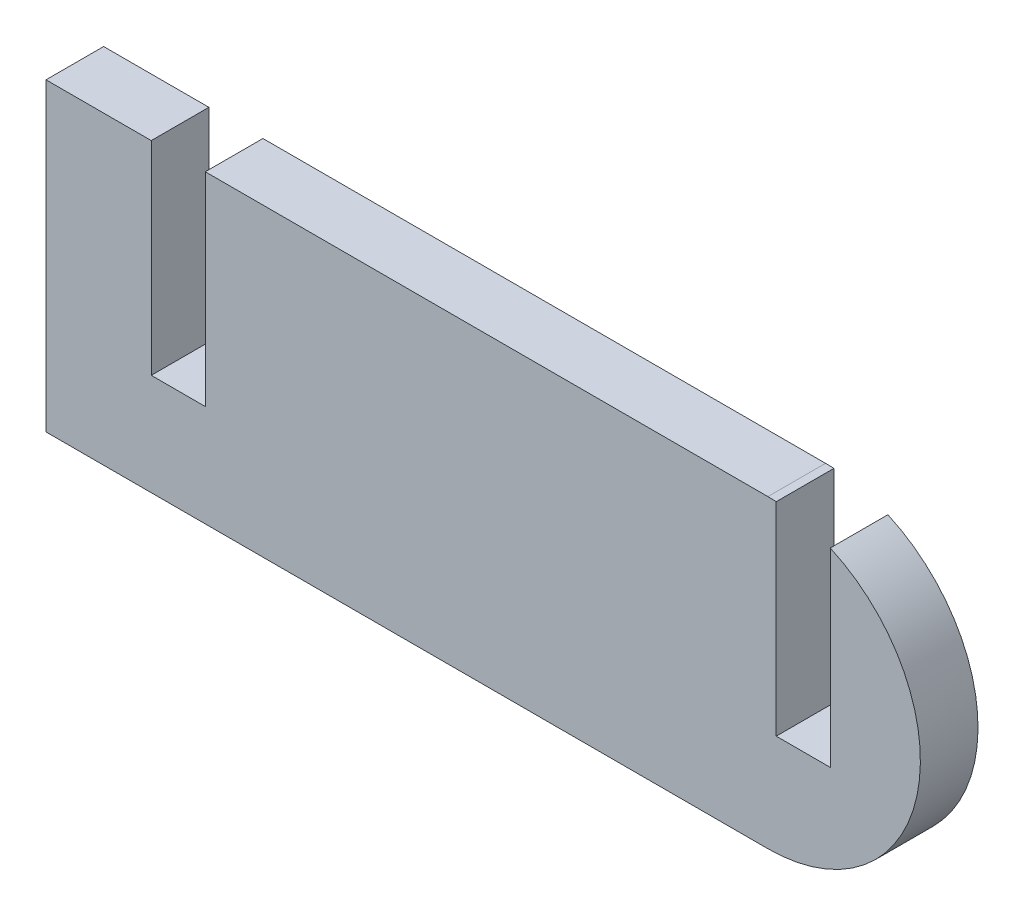
ISO-10303-21;
HEADER;
FILE_DESCRIPTION(('STEP AP214'),'2;1');
FILE_NAME('part.step','',(''),(''),'','','');
FILE_SCHEMA(('AUTOMOTIVE_DESIGN { 1 0 10303 214 1 1 1 1 }'));
ENDSEC;
DATA;
#1=APPLICATION_CONTEXT('core data for automotive mechanical design processes');
#2=APPLICATION_PROTOCOL_DEFINITION('international standard','automotive_design',2000,#1);
#3=PRODUCT_CONTEXT('',#1,'mechanical');
#4=PRODUCT('Part','Part','',(#3));
#5=PRODUCT_RELATED_PRODUCT_CATEGORY('part','',(#4));
#6=PRODUCT_DEFINITION_FORMATION('','',#4);
#7=PRODUCT_DEFINITION_CONTEXT('part definition',#1,'design');
#8=PRODUCT_DEFINITION('design','',#6,#7);
#9=PRODUCT_DEFINITION_SHAPE('','',#8);
#10=(LENGTH_UNIT() NAMED_UNIT(*) SI_UNIT(.MILLI.,.METRE.));
#11=(NAMED_UNIT(*) PLANE_ANGLE_UNIT() SI_UNIT($,.RADIAN.));
#12=(NAMED_UNIT(*) SI_UNIT($,.STERADIAN.) SOLID_ANGLE_UNIT());
#13=UNCERTAINTY_MEASURE_WITH_UNIT(LENGTH_MEASURE(1.E-05),#10,'distance_accuracy_value','');
#14=(GEOMETRIC_REPRESENTATION_CONTEXT(3) GLOBAL_UNCERTAINTY_ASSIGNED_CONTEXT((#13)) GLOBAL_UNIT_ASSIGNED_CONTEXT((#10,
#11,#12)) REPRESENTATION_CONTEXT('',''));
#15=CARTESIAN_POINT('',(0.,0.,0.));
#16=DIRECTION('',(0.,0.,1.));
#17=DIRECTION('',(1.,0.,0.));
#18=AXIS2_PLACEMENT_3D('',#15,#16,#17);
#19=CARTESIAN_POINT('',(-88.7437196029168,-84.7994159940034,4.800000052));
#20=DIRECTION('',(0.,-1.,0.));
#21=DIRECTION('',(0.,0.,-1.));
#22=AXIS2_PLACEMENT_3D('',#19,#20,#21);
#23=PLANE('',#22);
#24=DIRECTION('',(-1.,0.,0.));
#25=VECTOR('',#24,1.);
#26=CARTESIAN_POINT('',(-88.7437196029168,-84.7994159940034,0.));
#27=LINE('',#26,#25);
#28=CARTESIAN_POINT('',(-79.2537197869168,-84.7994159940034,0.));
#29=VERTEX_POINT('',#28);
#30=CARTESIAN_POINT('',(-88.0203863615838,-84.7994159940034,0.));
#31=VERTEX_POINT('',#30);
#32=EDGE_CURVE('E137',#29,#31,#27,.T.);
#33=ORIENTED_EDGE('',*,*,#32,.T.);
#34=DIRECTION('',(0.,0.,-1.));
#35=VECTOR('',#34,1.);
#36=CARTESIAN_POINT('',(-88.0203863615838,-84.7994159940034,4.800000052));
#37=LINE('',#36,#35);
#38=CARTESIAN_POINT('',(-88.0203863615838,-84.7994159940034,4.800000052));
#39=VERTEX_POINT('',#38);
#40=EDGE_CURVE('E49',#39,#31,#37,.T.);
#41=ORIENTED_EDGE('',*,*,#40,.F.);
#42=DIRECTION('',(-1.,0.,0.));
#43=VECTOR('',#42,1.);
#44=CARTESIAN_POINT('',(-88.7437196029168,-84.7994159940034,4.800000052));
#45=LINE('',#44,#43);
#46=CARTESIAN_POINT('',(-79.2537197869168,-84.7994159940034,4.800000052));
#47=VERTEX_POINT('',#46);
#48=EDGE_CURVE('E135',#47,#39,#45,.T.);
#49=ORIENTED_EDGE('',*,*,#48,.F.);
#50=DIRECTION('',(0.,0.,-1.));
#51=VECTOR('',#50,1.);
#52=CARTESIAN_POINT('',(-79.2537197869168,-84.7994159940034,4.800000052));
#53=LINE('',#52,#51);
#54=EDGE_CURVE('E191',#47,#29,#53,.T.);
#55=ORIENTED_EDGE('',*,*,#54,.T.);
#56=EDGE_LOOP('',(#33,#41,#49,#55));
#57=FACE_BOUND('',#56,.T.);
#58=ADVANCED_FACE('F34',(#57),#23,.F.);
#59=CARTESIAN_POINT('',(-27.8977196289168,-97.4994159940034,0.));
#60=DIRECTION('',(0.,0.,1.));
#61=DIRECTION('',(1.,0.,0.));
#62=AXIS2_PLACEMENT_3D('',#59,#60,#61);
#63=CYLINDRICAL_SURFACE('',#62,12.7);
#64=CARTESIAN_POINT('',(-27.8977196289168,-97.4994159940034,0.));
#65=DIRECTION('',(0.,0.,-1.));
#66=DIRECTION('',(1.,0.,0.));
#67=AXIS2_PLACEMENT_3D('',#64,#65,#66);
#68=CIRCLE('',#67,12.7);
#69=CARTESIAN_POINT('',(-22.7037196029168,-85.9100948866256,0.));
#70=VERTEX_POINT('',#69);
#71=CARTESIAN_POINT('',(-27.8977196289168,-110.199415994003,0.));
#72=VERTEX_POINT('',#71);
#73=EDGE_CURVE('E174',#70,#72,#68,.T.);
#74=ORIENTED_EDGE('',*,*,#73,.F.);
#75=DIRECTION('',(0.,0.,1.));
#76=VECTOR('',#75,1.);
#77=CARTESIAN_POINT('',(-22.7037196029168,-85.9100948866256,0.));
#78=LINE('',#77,#76);
#79=CARTESIAN_POINT('',(-22.7037196029168,-85.9100948866256,4.800000052));
#80=VERTEX_POINT('',#79);
#81=EDGE_CURVE('E11',#70,#80,#78,.T.);
#82=ORIENTED_EDGE('',*,*,#81,.T.);
#83=CARTESIAN_POINT('',(-27.8977196289168,-97.4994159940034,4.800000052));
#84=DIRECTION('',(0.,0.,-1.));
#85=DIRECTION('',(1.,0.,0.));
#86=AXIS2_PLACEMENT_3D('',#83,#84,#85);
#87=CIRCLE('',#86,12.7);
#88=CARTESIAN_POINT('',(-27.8977196289168,-110.199415994003,4.800000052));
#89=VERTEX_POINT('',#88);
#90=EDGE_CURVE('E183',#80,#89,#87,.T.);
#91=ORIENTED_EDGE('',*,*,#90,.T.);
#92=DIRECTION('',(0.,0.,1.));
#93=VECTOR('',#92,1.);
#94=CARTESIAN_POINT('',(-27.8977196289168,-110.199415994003,0.));
#95=LINE('',#94,#93);
#96=EDGE_CURVE('E173',#72,#89,#95,.T.);
#97=ORIENTED_EDGE('',*,*,#96,.F.);
#98=EDGE_LOOP('',(#74,#82,#91,#97));
#99=FACE_BOUND('',#98,.T.);
#100=ADVANCED_FACE('F223',(#99),#63,.T.);
#101=CARTESIAN_POINT('',(-88.7437196029168,-110.199415994003,4.800000052));
#102=DIRECTION('',(0.,1.,0.));
#103=DIRECTION('',(0.,0.,1.));
#104=AXIS2_PLACEMENT_3D('',#101,#102,#103);
#105=PLANE('',#104);
#106=DIRECTION('',(1.,0.,0.));
#107=VECTOR('',#106,1.);
#108=CARTESIAN_POINT('',(-88.7437196029168,-110.199415994003,4.800000052));
#109=LINE('',#108,#107);
#110=CARTESIAN_POINT('',(-88.0203863615838,-110.199415994003,4.800000052));
#111=VERTEX_POINT('',#110);
#112=EDGE_CURVE('E145',#111,#89,#109,.T.);
#113=ORIENTED_EDGE('',*,*,#112,.F.);
#114=DIRECTION('',(0.,0.,-1.));
#115=VECTOR('',#114,1.);
#116=CARTESIAN_POINT('',(-88.0203863615838,-110.199415994003,4.800000052));
#117=LINE('',#116,#115);
#118=CARTESIAN_POINT('',(-88.0203863615838,-110.199415994003,0.));
#119=VERTEX_POINT('',#118);
#120=EDGE_CURVE('E125',#111,#119,#117,.T.);
#121=ORIENTED_EDGE('',*,*,#120,.T.);
#122=DIRECTION('',(1.,0.,0.));
#123=VECTOR('',#122,1.);
#124=CARTESIAN_POINT('',(-88.7437196029168,-110.199415994003,0.));
#125=LINE('',#124,#123);
#126=EDGE_CURVE('E152',#119,#72,#125,.T.);
#127=ORIENTED_EDGE('',*,*,#126,.T.);
#128=ORIENTED_EDGE('',*,*,#96,.T.);
#129=EDGE_LOOP('',(#113,#121,#127,#128));
#130=FACE_BOUND('',#129,.T.);
#131=ADVANCED_FACE('F36',(#130),#105,.F.);
#132=CARTESIAN_POINT('',(-27.8977196289168,-84.7994159940034,0.));
#133=VERTEX_POINT('',#132);
#134=CARTESIAN_POINT('',(-74.7537196429168,-84.7994159940034,0.));
#135=VERTEX_POINT('',#134);
#136=EDGE_CURVE('E148',#133,#135,#27,.T.);
#137=ORIENTED_EDGE('',*,*,#136,.T.);
#138=DIRECTION('',(0.,0.,-1.));
#139=VECTOR('',#138,1.);
#140=CARTESIAN_POINT('',(-74.7537196429168,-84.7994159940034,4.800000052));
#141=LINE('',#140,#139);
#142=CARTESIAN_POINT('',(-74.7537196429168,-84.7994159940034,4.800000052));
#143=VERTEX_POINT('',#142);
#144=EDGE_CURVE('E57',#143,#135,#141,.T.);
#145=ORIENTED_EDGE('',*,*,#144,.F.);
#146=CARTESIAN_POINT('',(-27.8977196289168,-84.7994159940034,4.800000052));
#147=VERTEX_POINT('',#146);
#148=EDGE_CURVE('E144',#147,#143,#45,.T.);
#149=ORIENTED_EDGE('',*,*,#148,.F.);
#150=DIRECTION('',(0.,0.,1.));
#151=VECTOR('',#150,1.);
#152=CARTESIAN_POINT('',(-27.8977196289168,-84.7994159940034,0.));
#153=LINE('',#152,#151);
#154=EDGE_CURVE('E154',#133,#147,#153,.T.);
#155=ORIENTED_EDGE('',*,*,#154,.F.);
#156=EDGE_LOOP('',(#137,#145,#149,#155));
#157=FACE_BOUND('',#156,.T.);
#158=ADVANCED_FACE('F189',(#157),#23,.F.);
#159=CARTESIAN_POINT('',(0.,0.,4.800000052));
#160=DIRECTION('',(0.,0.,-1.));
#161=DIRECTION('',(-1.,0.,0.));
#162=AXIS2_PLACEMENT_3D('',#159,#160,#161);
#163=PLANE('',#162);
#164=ORIENTED_EDGE('',*,*,#48,.T.);
#165=DIRECTION('',(0.,-1.,0.));
#166=VECTOR('',#165,1.);
#167=CARTESIAN_POINT('',(-88.0203863615838,0.,4.800000052));
#168=LINE('',#167,#166);
#169=EDGE_CURVE('E122',#39,#111,#168,.T.);
#170=ORIENTED_EDGE('',*,*,#169,.T.);
#171=ORIENTED_EDGE('',*,*,#112,.T.);
#172=ORIENTED_EDGE('',*,*,#90,.F.);
#173=DIRECTION('',(0.,1.,0.));
#174=VECTOR('',#173,1.);
#175=CARTESIAN_POINT('',(-22.7037196029168,-84.7994159940034,4.800000052));
#176=LINE('',#175,#174);
#177=CARTESIAN_POINT('',(-22.7037196029168,-101.732749327337,4.800000052));
#178=VERTEX_POINT('',#177);
#179=EDGE_CURVE('E206',#178,#80,#176,.T.);
#180=ORIENTED_EDGE('',*,*,#179,.F.);
#181=DIRECTION('',(1.,0.,0.));
#182=VECTOR('',#181,1.);
#183=CARTESIAN_POINT('',(-22.7037196029168,-101.732749327337,4.800000052));
#184=LINE('',#183,#182);
#185=CARTESIAN_POINT('',(-27.2037197469168,-101.732749327337,4.800000052));
#186=VERTEX_POINT('',#185);
#187=EDGE_CURVE('E202',#186,#178,#184,.T.);
#188=ORIENTED_EDGE('',*,*,#187,.F.);
#189=DIRECTION('',(0.,-1.,0.));
#190=VECTOR('',#189,1.);
#191=CARTESIAN_POINT('',(-27.2037197469168,-84.7994159940034,4.800000052));
#192=LINE('',#191,#190);
#193=CARTESIAN_POINT('',(-27.2037197469168,-84.8183922118404,4.800000052));
#194=VERTEX_POINT('',#193);
#195=EDGE_CURVE('E188',#194,#186,#192,.T.);
#196=ORIENTED_EDGE('',*,*,#195,.F.);
#197=EDGE_CURVE('E164',#147,#194,#87,.T.);
#198=ORIENTED_EDGE('',*,*,#197,.F.);
#199=ORIENTED_EDGE('',*,*,#148,.T.);
#200=DIRECTION('',(0.,-1.,0.));
#201=VECTOR('',#200,1.);
#202=CARTESIAN_POINT('',(-74.7537196429168,-101.732749327337,4.800000052));
#203=LINE('',#202,#201);
#204=CARTESIAN_POINT('',(-74.7537196429168,-101.732749327337,4.800000052));
#205=VERTEX_POINT('',#204);
#206=EDGE_CURVE('E234',#143,#205,#203,.T.);
#207=ORIENTED_EDGE('',*,*,#206,.T.);
#208=DIRECTION('',(-1.,0.,0.));
#209=VECTOR('',#208,1.);
#210=CARTESIAN_POINT('',(-79.2537197869168,-101.732749327337,4.800000052));
#211=LINE('',#210,#209);
#212=CARTESIAN_POINT('',(-79.2537197869168,-101.732749327337,4.800000052));
#213=VERTEX_POINT('',#212);
#214=EDGE_CURVE('E195',#205,#213,#211,.T.);
#215=ORIENTED_EDGE('',*,*,#214,.T.);
#216=DIRECTION('',(0.,1.,0.));
#217=VECTOR('',#216,1.);
#218=CARTESIAN_POINT('',(-79.2537197869168,-101.732749327337,4.800000052));
#219=LINE('',#218,#217);
#220=EDGE_CURVE('E143',#213,#47,#219,.T.);
#221=ORIENTED_EDGE('',*,*,#220,.T.);
#222=EDGE_LOOP('',(#164,#170,#171,#172,#180,#188,#196,#198,#199,#207,#215,#221));
#223=FACE_BOUND('',#222,.T.);
#224=ADVANCED_FACE('F140',(#223),#163,.F.);
#225=CARTESIAN_POINT('',(0.,0.,0.));
#226=DIRECTION('',(0.,0.,-1.));
#227=DIRECTION('',(-1.,0.,0.));
#228=AXIS2_PLACEMENT_3D('',#225,#226,#227);
#229=PLANE('',#228);
#230=DIRECTION('',(0.,-1.,0.));
#231=VECTOR('',#230,1.);
#232=CARTESIAN_POINT('',(-88.0203863615838,0.,0.));
#233=LINE('',#232,#231);
#234=EDGE_CURVE('E129',#31,#119,#233,.T.);
#235=ORIENTED_EDGE('',*,*,#234,.F.);
#236=ORIENTED_EDGE('',*,*,#32,.F.);
#237=DIRECTION('',(0.,1.,0.));
#238=VECTOR('',#237,1.);
#239=CARTESIAN_POINT('',(-79.2537197869168,-101.732749327337,0.));
#240=LINE('',#239,#238);
#241=CARTESIAN_POINT('',(-79.2537197869168,-101.732749327337,0.));
#242=VERTEX_POINT('',#241);
#243=EDGE_CURVE('E227',#242,#29,#240,.T.);
#244=ORIENTED_EDGE('',*,*,#243,.F.);
#245=DIRECTION('',(-1.,0.,0.));
#246=VECTOR('',#245,1.);
#247=CARTESIAN_POINT('',(-79.2537197869168,-101.732749327337,0.));
#248=LINE('',#247,#246);
#249=CARTESIAN_POINT('',(-74.7537196429168,-101.732749327337,0.));
#250=VERTEX_POINT('',#249);
#251=EDGE_CURVE('E235',#250,#242,#248,.T.);
#252=ORIENTED_EDGE('',*,*,#251,.F.);
#253=DIRECTION('',(0.,-1.,0.));
#254=VECTOR('',#253,1.);
#255=CARTESIAN_POINT('',(-74.7537196429168,-101.732749327337,0.));
#256=LINE('',#255,#254);
#257=EDGE_CURVE('E229',#135,#250,#256,.T.);
#258=ORIENTED_EDGE('',*,*,#257,.F.);
#259=ORIENTED_EDGE('',*,*,#136,.F.);
#260=CARTESIAN_POINT('',(-27.2037197469168,-84.8183922118404,0.));
#261=VERTEX_POINT('',#260);
#262=EDGE_CURVE('E161',#133,#261,#68,.T.);
#263=ORIENTED_EDGE('',*,*,#262,.T.);
#264=DIRECTION('',(0.,-1.,0.));
#265=VECTOR('',#264,1.);
#266=CARTESIAN_POINT('',(-27.2037197469168,-84.7994159940034,0.));
#267=LINE('',#266,#265);
#268=CARTESIAN_POINT('',(-27.2037197469168,-101.732749327337,0.));
#269=VERTEX_POINT('',#268);
#270=EDGE_CURVE('E172',#261,#269,#267,.T.);
#271=ORIENTED_EDGE('',*,*,#270,.T.);
#272=DIRECTION('',(1.,0.,0.));
#273=VECTOR('',#272,1.);
#274=CARTESIAN_POINT('',(-22.7037196029168,-101.732749327337,0.));
#275=LINE('',#274,#273);
#276=CARTESIAN_POINT('',(-22.7037196029168,-101.732749327337,0.));
#277=VERTEX_POINT('',#276);
#278=EDGE_CURVE('E204',#269,#277,#275,.T.);
#279=ORIENTED_EDGE('',*,*,#278,.T.);
#280=DIRECTION('',(0.,1.,0.));
#281=VECTOR('',#280,1.);
#282=CARTESIAN_POINT('',(-22.7037196029168,-84.7994159940034,0.));
#283=LINE('',#282,#281);
#284=EDGE_CURVE('E199',#277,#70,#283,.T.);
#285=ORIENTED_EDGE('',*,*,#284,.T.);
#286=ORIENTED_EDGE('',*,*,#73,.T.);
#287=ORIENTED_EDGE('',*,*,#126,.F.);
#288=EDGE_LOOP('',(#235,#236,#244,#252,#258,#259,#263,#271,#279,#285,#286,#287));
#289=FACE_BOUND('',#288,.T.);
#290=ADVANCED_FACE('F170',(#289),#229,.T.);
#291=ORIENTED_EDGE('',*,*,#197,.T.);
#292=DIRECTION('',(0.,0.,1.));
#293=VECTOR('',#292,1.);
#294=CARTESIAN_POINT('',(-27.2037197469168,-84.8183922118404,0.));
#295=LINE('',#294,#293);
#296=EDGE_CURVE('E42',#194,#261,#295,.F.);
#297=ORIENTED_EDGE('',*,*,#296,.T.);
#298=ORIENTED_EDGE('',*,*,#262,.F.);
#299=ORIENTED_EDGE('',*,*,#154,.T.);
#300=EDGE_LOOP('',(#291,#297,#298,#299));
#301=FACE_BOUND('',#300,.T.);
#302=ADVANCED_FACE('F160',(#301),#63,.T.);
#303=CARTESIAN_POINT('',(-22.7037196029168,-84.7994159940034,0.));
#304=DIRECTION('',(1.,0.,0.));
#305=DIRECTION('',(0.,1.,0.));
#306=AXIS2_PLACEMENT_3D('',#303,#304,#305);
#307=PLANE('',#306);
#308=ORIENTED_EDGE('',*,*,#284,.F.);
#309=DIRECTION('',(0.,0.,1.));
#310=VECTOR('',#309,1.);
#311=CARTESIAN_POINT('',(-22.7037196029168,-101.732749327337,0.));
#312=LINE('',#311,#310);
#313=EDGE_CURVE('E210',#277,#178,#312,.T.);
#314=ORIENTED_EDGE('',*,*,#313,.T.);
#315=ORIENTED_EDGE('',*,*,#179,.T.);
#316=ORIENTED_EDGE('',*,*,#81,.F.);
#317=EDGE_LOOP('',(#308,#314,#315,#316));
#318=FACE_BOUND('',#317,.T.);
#319=ADVANCED_FACE('F220',(#318),#307,.F.);
#320=CARTESIAN_POINT('',(-27.2037197469168,-84.7994159940034,0.));
#321=DIRECTION('',(-1.,0.,0.));
#322=DIRECTION('',(0.,-1.,0.));
#323=AXIS2_PLACEMENT_3D('',#320,#321,#322);
#324=PLANE('',#323);
#325=ORIENTED_EDGE('',*,*,#195,.T.);
#326=DIRECTION('',(0.,0.,1.));
#327=VECTOR('',#326,1.);
#328=CARTESIAN_POINT('',(-27.2037197469168,-101.732749327337,0.));
#329=LINE('',#328,#327);
#330=EDGE_CURVE('E180',#269,#186,#329,.T.);
#331=ORIENTED_EDGE('',*,*,#330,.F.);
#332=ORIENTED_EDGE('',*,*,#270,.F.);
#333=ORIENTED_EDGE('',*,*,#296,.F.);
#334=EDGE_LOOP('',(#325,#331,#332,#333));
#335=FACE_BOUND('',#334,.T.);
#336=ADVANCED_FACE('F293',(#335),#324,.F.);
#337=CARTESIAN_POINT('',(-22.7037196029168,-101.732749327337,0.));
#338=DIRECTION('',(0.,-1.,0.));
#339=DIRECTION('',(0.,0.,-1.));
#340=AXIS2_PLACEMENT_3D('',#337,#338,#339);
#341=PLANE('',#340);
#342=ORIENTED_EDGE('',*,*,#187,.T.);
#343=ORIENTED_EDGE('',*,*,#313,.F.);
#344=ORIENTED_EDGE('',*,*,#278,.F.);
#345=ORIENTED_EDGE('',*,*,#330,.T.);
#346=EDGE_LOOP('',(#342,#343,#344,#345));
#347=FACE_BOUND('',#346,.T.);
#348=ADVANCED_FACE('F217',(#347),#341,.F.);
#349=CARTESIAN_POINT('',(-79.2537197869168,-101.732749327337,4.800000052));
#350=DIRECTION('',(-1.,0.,0.));
#351=DIRECTION('',(0.,0.,1.));
#352=AXIS2_PLACEMENT_3D('',#349,#350,#351);
#353=PLANE('',#352);
#354=ORIENTED_EDGE('',*,*,#243,.T.);
#355=ORIENTED_EDGE('',*,*,#54,.F.);
#356=ORIENTED_EDGE('',*,*,#220,.F.);
#357=DIRECTION('',(0.,0.,-1.));
#358=VECTOR('',#357,1.);
#359=CARTESIAN_POINT('',(-79.2537197869168,-101.732749327337,4.800000052));
#360=LINE('',#359,#358);
#361=EDGE_CURVE('E193',#213,#242,#360,.T.);
#362=ORIENTED_EDGE('',*,*,#361,.T.);
#363=EDGE_LOOP('',(#354,#355,#356,#362));
#364=FACE_BOUND('',#363,.T.);
#365=ADVANCED_FACE('F241',(#364),#353,.F.);
#366=CARTESIAN_POINT('',(-79.2537197869168,-101.732749327337,4.800000052));
#367=DIRECTION('',(0.,-1.,0.));
#368=DIRECTION('',(0.,0.,-1.));
#369=AXIS2_PLACEMENT_3D('',#366,#367,#368);
#370=PLANE('',#369);
#371=ORIENTED_EDGE('',*,*,#251,.T.);
#372=ORIENTED_EDGE('',*,*,#361,.F.);
#373=ORIENTED_EDGE('',*,*,#214,.F.);
#374=DIRECTION('',(0.,0.,-1.));
#375=VECTOR('',#374,1.);
#376=CARTESIAN_POINT('',(-74.7537196429168,-101.732749327337,4.800000052));
#377=LINE('',#376,#375);
#378=EDGE_CURVE('E190',#205,#250,#377,.T.);
#379=ORIENTED_EDGE('',*,*,#378,.T.);
#380=EDGE_LOOP('',(#371,#372,#373,#379));
#381=FACE_BOUND('',#380,.T.);
#382=ADVANCED_FACE('F246',(#381),#370,.F.);
#383=CARTESIAN_POINT('',(-74.7537196429168,-101.732749327337,4.800000052));
#384=DIRECTION('',(1.,0.,0.));
#385=DIRECTION('',(0.,0.,-1.));
#386=AXIS2_PLACEMENT_3D('',#383,#384,#385);
#387=PLANE('',#386);
#388=ORIENTED_EDGE('',*,*,#257,.T.);
#389=ORIENTED_EDGE('',*,*,#378,.F.);
#390=ORIENTED_EDGE('',*,*,#206,.F.);
#391=ORIENTED_EDGE('',*,*,#144,.T.);
#392=EDGE_LOOP('',(#388,#389,#390,#391));
#393=FACE_BOUND('',#392,.T.);
#394=ADVANCED_FACE('F247',(#393),#387,.F.);
#395=CARTESIAN_POINT('',(-88.0203863615838,0.,4.800000052));
#396=DIRECTION('',(1.,0.,0.));
#397=DIRECTION('',(0.,0.,-1.));
#398=AXIS2_PLACEMENT_3D('',#395,#396,#397);
#399=PLANE('',#398);
#400=ORIENTED_EDGE('',*,*,#234,.T.);
#401=ORIENTED_EDGE('',*,*,#120,.F.);
#402=ORIENTED_EDGE('',*,*,#169,.F.);
#403=ORIENTED_EDGE('',*,*,#40,.T.);
#404=EDGE_LOOP('',(#400,#401,#402,#403));
#405=FACE_BOUND('',#404,.T.);
#406=ADVANCED_FACE('F123',(#405),#399,.F.);
#407=CLOSED_SHELL('',(#58,#100,#131,#158,#224,#290,#302,#319,#336,#348,#365,#382,#394,#406));
#408=MANIFOLD_SOLID_BREP('B2',#407);
#409=ADVANCED_BREP_SHAPE_REPRESENTATION('',(#18,#408),#14);
#410=SHAPE_DEFINITION_REPRESENTATION(#9,#409);
ENDSEC;
END-ISO-10303-21;
